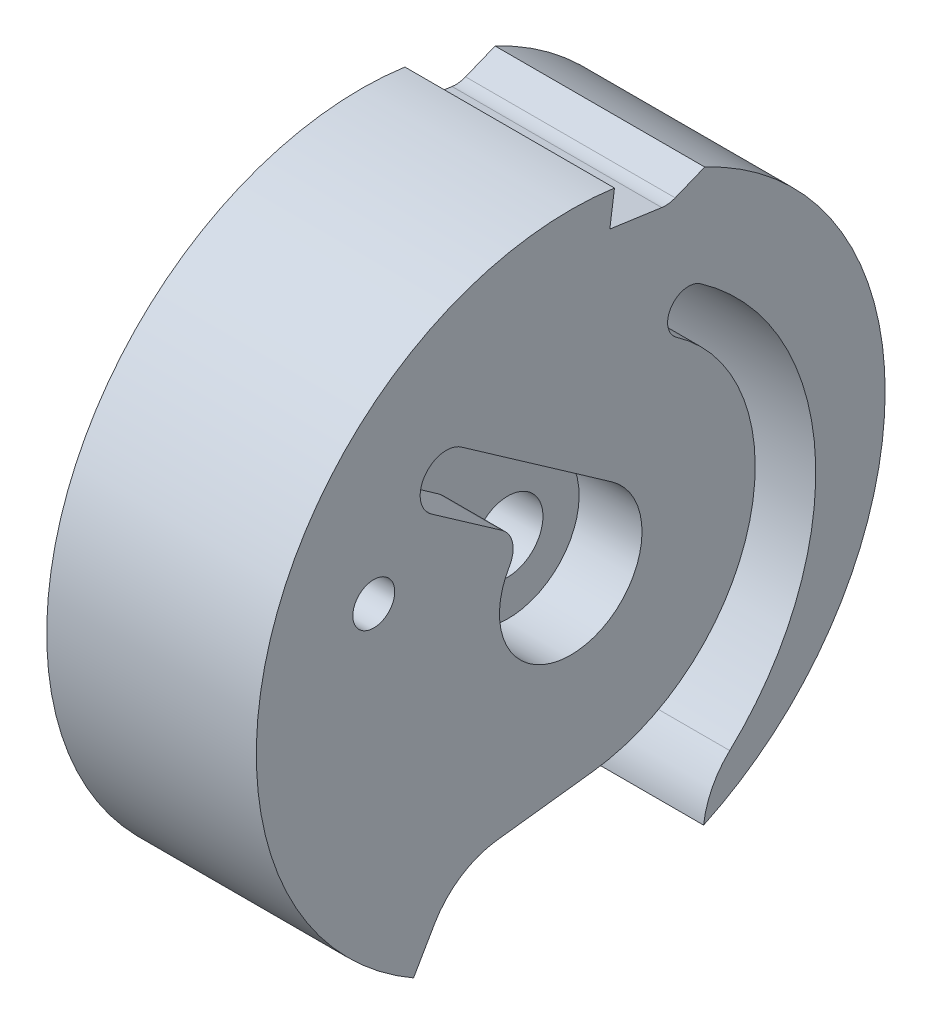
ISO-10303-21;
HEADER;
FILE_DESCRIPTION(('STEP AP214'),'2;1');
FILE_NAME('part.step','',(''),(''),'','','');
FILE_SCHEMA(('AUTOMOTIVE_DESIGN { 1 0 10303 214 1 1 1 1 }'));
ENDSEC;
DATA;
#1=APPLICATION_CONTEXT('core data for automotive mechanical design processes');
#2=APPLICATION_PROTOCOL_DEFINITION('international standard','automotive_design',2000,#1);
#3=PRODUCT_CONTEXT('',#1,'mechanical');
#4=PRODUCT('Part','Part','',(#3));
#5=PRODUCT_RELATED_PRODUCT_CATEGORY('part','',(#4));
#6=PRODUCT_DEFINITION_FORMATION('','',#4);
#7=PRODUCT_DEFINITION_CONTEXT('part definition',#1,'design');
#8=PRODUCT_DEFINITION('design','',#6,#7);
#9=PRODUCT_DEFINITION_SHAPE('','',#8);
#10=(LENGTH_UNIT() NAMED_UNIT(*) SI_UNIT(.MILLI.,.METRE.));
#11=(NAMED_UNIT(*) PLANE_ANGLE_UNIT() SI_UNIT($,.RADIAN.));
#12=(NAMED_UNIT(*) SI_UNIT($,.STERADIAN.) SOLID_ANGLE_UNIT());
#13=UNCERTAINTY_MEASURE_WITH_UNIT(LENGTH_MEASURE(1.E-05),#10,'distance_accuracy_value','');
#14=(GEOMETRIC_REPRESENTATION_CONTEXT(3) GLOBAL_UNCERTAINTY_ASSIGNED_CONTEXT((#13)) GLOBAL_UNIT_ASSIGNED_CONTEXT((#10,
#11,#12)) REPRESENTATION_CONTEXT('',''));
#15=CARTESIAN_POINT('',(0.,0.,0.));
#16=DIRECTION('',(0.,0.,1.));
#17=DIRECTION('',(1.,0.,0.));
#18=AXIS2_PLACEMENT_3D('',#15,#16,#17);
#19=CARTESIAN_POINT('',(1.27,0.,0.));
#20=DIRECTION('',(1.,0.,0.));
#21=DIRECTION('',(0.,0.,1.));
#22=AXIS2_PLACEMENT_3D('',#19,#20,#21);
#23=CYLINDRICAL_SURFACE('',#22,2.159);
#24=CARTESIAN_POINT('',(3.175,0.,0.));
#25=DIRECTION('',(-1.,0.,0.));
#26=DIRECTION('',(0.,0.,1.));
#27=AXIS2_PLACEMENT_3D('',#24,#25,#26);
#28=CIRCLE('',#27,2.159);
#29=CARTESIAN_POINT('',(3.175,1.76854926361994,-1.2383515260819));
#30=VERTEX_POINT('',#29);
#31=CARTESIAN_POINT('',(3.175,1.10172205716822,1.85674163758694));
#32=VERTEX_POINT('',#31);
#33=EDGE_CURVE('E512',#30,#32,#28,.T.);
#34=ORIENTED_EDGE('',*,*,#33,.F.);
#35=DIRECTION('',(1.,0.,0.));
#36=VECTOR('',#35,1.);
#37=CARTESIAN_POINT('',(-5.90003269482934,1.76854926361994,-1.2383515260819));
#38=LINE('',#37,#36);
#39=CARTESIAN_POINT('',(1.27,1.76854926361994,-1.2383515260819));
#40=VERTEX_POINT('',#39);
#41=EDGE_CURVE('E516',#40,#30,#38,.T.);
#42=ORIENTED_EDGE('',*,*,#41,.F.);
#43=CARTESIAN_POINT('',(1.27,0.,0.));
#44=DIRECTION('',(-1.,0.,0.));
#45=DIRECTION('',(0.,0.,1.));
#46=AXIS2_PLACEMENT_3D('',#43,#44,#45);
#47=CIRCLE('',#46,2.159);
#48=CARTESIAN_POINT('',(1.27,1.10172205716822,1.85674163758694));
#49=VERTEX_POINT('',#48);
#50=EDGE_CURVE('E528',#40,#49,#47,.T.);
#51=ORIENTED_EDGE('',*,*,#50,.T.);
#52=DIRECTION('',(1.,0.,0.));
#53=VECTOR('',#52,1.);
#54=CARTESIAN_POINT('',(1.27,1.10172205716822,1.85674163758694));
#55=LINE('',#54,#53);
#56=EDGE_CURVE('E527',#32,#49,#55,.F.);
#57=ORIENTED_EDGE('',*,*,#56,.F.);
#58=EDGE_LOOP('',(#34,#42,#51,#57));
#59=FACE_BOUND('',#58,.T.);
#60=ADVANCED_FACE('F372',(#59),#23,.F.);
#61=CARTESIAN_POINT('',(-3.175,0.,0.));
#62=DIRECTION('',(1.,0.,0.));
#63=DIRECTION('',(0.,0.,1.));
#64=AXIS2_PLACEMENT_3D('',#61,#62,#63);
#65=CYLINDRICAL_SURFACE('',#64,1.063625);
#66=CARTESIAN_POINT('',(-3.175,0.,0.));
#67=DIRECTION('',(1.,0.,0.));
#68=DIRECTION('',(0.,0.,-1.));
#69=AXIS2_PLACEMENT_3D('',#66,#67,#68);
#70=CIRCLE('',#69,1.063625);
#71=CARTESIAN_POINT('',(-3.175,0.,-1.063625));
#72=VERTEX_POINT('',#71);
#73=EDGE_CURVE('E575',#72,#72,#70,.T.);
#74=ORIENTED_EDGE('',*,*,#73,.F.);
#75=EDGE_LOOP('',(#74));
#76=FACE_BOUND('',#75,.T.);
#77=CARTESIAN_POINT('',(1.27,0.,0.));
#78=DIRECTION('',(-1.,0.,0.));
#79=DIRECTION('',(0.,0.,1.));
#80=AXIS2_PLACEMENT_3D('',#77,#78,#79);
#81=CIRCLE('',#80,1.063625);
#82=CARTESIAN_POINT('',(1.27,0.,1.063625));
#83=VERTEX_POINT('',#82);
#84=EDGE_CURVE('E531',#83,#83,#81,.T.);
#85=ORIENTED_EDGE('',*,*,#84,.F.);
#86=EDGE_LOOP('',(#85));
#87=FACE_BOUND('',#86,.T.);
#88=ADVANCED_FACE('F680',(#76,#87),#65,.F.);
#89=CARTESIAN_POINT('',(-3.175,0.,0.));
#90=DIRECTION('',(1.,0.,0.));
#91=DIRECTION('',(0.,0.,1.));
#92=AXIS2_PLACEMENT_3D('',#89,#90,#91);
#93=CYLINDRICAL_SURFACE('',#92,9.525);
#94=CARTESIAN_POINT('',(3.175,0.,0.));
#95=DIRECTION('',(1.,0.,0.));
#96=DIRECTION('',(0.,0.,-1.));
#97=AXIS2_PLACEMENT_3D('',#94,#95,#96);
#98=CIRCLE('',#97,9.525);
#99=CARTESIAN_POINT('',(3.175,-8.63258167152409,-4.02543894308017));
#100=VERTEX_POINT('',#99);
#101=CARTESIAN_POINT('',(3.175,8.61687533606395,-4.05895115057237));
#102=VERTEX_POINT('',#101);
#103=EDGE_CURVE('E582',#100,#102,#98,.T.);
#104=ORIENTED_EDGE('',*,*,#103,.F.);
#105=DIRECTION('',(1.,0.,0.));
#106=VECTOR('',#105,1.);
#107=CARTESIAN_POINT('',(-3.175,-8.63258167152409,-4.02543894308017));
#108=LINE('',#107,#106);
#109=CARTESIAN_POINT('',(-3.175,-8.63258167152409,-4.02543894308017));
#110=VERTEX_POINT('',#109);
#111=EDGE_CURVE('E624',#110,#100,#108,.T.);
#112=ORIENTED_EDGE('',*,*,#111,.F.);
#113=CARTESIAN_POINT('',(-3.175,0.,0.));
#114=DIRECTION('',(1.,0.,0.));
#115=DIRECTION('',(0.,0.,-1.));
#116=AXIS2_PLACEMENT_3D('',#113,#114,#115);
#117=CIRCLE('',#116,9.525);
#118=CARTESIAN_POINT('',(-3.175,8.61687533606395,-4.05895115057237));
#119=VERTEX_POINT('',#118);
#120=EDGE_CURVE('E601',#110,#119,#117,.T.);
#121=ORIENTED_EDGE('',*,*,#120,.T.);
#122=DIRECTION('',(-1.,0.,0.));
#123=VECTOR('',#122,1.);
#124=CARTESIAN_POINT('',(3.175,8.61687533606395,-4.05895115057237));
#125=LINE('',#124,#123);
#126=EDGE_CURVE('E559',#102,#119,#125,.T.);
#127=ORIENTED_EDGE('',*,*,#126,.F.);
#128=EDGE_LOOP('',(#104,#112,#121,#127));
#129=FACE_BOUND('',#128,.T.);
#130=ADVANCED_FACE('F685',(#129),#93,.T.);
#131=CARTESIAN_POINT('',(-3.175,-1.08440458337613,0.759308263749316));
#132=DIRECTION('',(-1.,0.,0.));
#133=DIRECTION('',(0.,0.,-1.));
#134=AXIS2_PLACEMENT_3D('',#131,#132,#133);
#135=PLANE('',#134);
#136=CARTESIAN_POINT('',(-3.175,-1.08440458337613,0.759308263749316));
#137=DIRECTION('',(-1.,0.,0.));
#138=DIRECTION('',(0.,0.,-1.));
#139=AXIS2_PLACEMENT_3D('',#136,#137,#138);
#140=CIRCLE('',#139,8.18181355932214);
#141=CARTESIAN_POINT('',(-3.175,5.61774471973393,-3.93358720049544));
#142=VERTEX_POINT('',#141);
#143=CARTESIAN_POINT('',(-3.175,-7.07179536584988,-4.8168216430459));
#144=VERTEX_POINT('',#143);
#145=EDGE_CURVE('E597',#142,#144,#140,.T.);
#146=ORIENTED_EDGE('',*,*,#145,.F.);
#147=CARTESIAN_POINT('',(-3.175,5.09758317161043,-3.56936616341251));
#148=DIRECTION('',(-1.,0.,0.));
#149=DIRECTION('',(0.,0.,1.));
#150=AXIS2_PLACEMENT_3D('',#147,#148,#149);
#151=CIRCLE('',#150,0.635);
#152=CARTESIAN_POINT('',(-3.175,4.57742162348692,-3.2051451263296));
#153=VERTEX_POINT('',#152);
#154=EDGE_CURVE('E613',#153,#142,#151,.T.);
#155=ORIENTED_EDGE('',*,*,#154,.F.);
#156=CARTESIAN_POINT('',(-3.175,0.,0.));
#157=DIRECTION('',(1.,0.,0.));
#158=DIRECTION('',(0.,0.,1.));
#159=AXIS2_PLACEMENT_3D('',#156,#157,#158);
#160=CIRCLE('',#159,5.588);
#161=CARTESIAN_POINT('',(-3.175,-5.54787996507796,-0.668409973808462));
#162=VERTEX_POINT('',#161);
#163=EDGE_CURVE('E610',#162,#153,#160,.T.);
#164=ORIENTED_EDGE('',*,*,#163,.F.);
#165=DIRECTION('',(0.,0.119615242270661,-0.992820323027551));
#166=VECTOR('',#165,1.);
#167=CARTESIAN_POINT('',(-3.175,-5.54787996507796,-0.668409973808462));
#168=LINE('',#167,#166);
#169=CARTESIAN_POINT('',(-3.175,-5.89727608775056,2.23161818975502));
#170=VERTEX_POINT('',#169);
#171=EDGE_CURVE('E607',#170,#162,#168,.T.);
#172=ORIENTED_EDGE('',*,*,#171,.F.);
#173=CARTESIAN_POINT('',(-3.175,-8.41903970824054,1.92779547438754));
#174=DIRECTION('',(1.,0.,0.));
#175=DIRECTION('',(0.,0.,-1.));
#176=AXIS2_PLACEMENT_3D('',#173,#174,#175);
#177=CIRCLE('',#176,2.54);
#178=CARTESIAN_POINT('',(-3.175,-7.14903970824053,4.12750000000001));
#179=VERTEX_POINT('',#178);
#180=EDGE_CURVE('E641',#179,#170,#177,.F.);
#181=ORIENTED_EDGE('',*,*,#180,.F.);
#182=DIRECTION('',(0.,0.866025403784438,-0.500000000000001));
#183=VECTOR('',#182,1.);
#184=CARTESIAN_POINT('',(-3.175,-6.0491874454343,3.49250000000001));
#185=LINE('',#184,#183);
#186=CARTESIAN_POINT('',(-3.175,-8.24889197104677,4.76250000000001));
#187=VERTEX_POINT('',#186);
#188=EDGE_CURVE('E604',#187,#179,#185,.T.);
#189=ORIENTED_EDGE('',*,*,#188,.F.);
#190=CARTESIAN_POINT('',(-3.175,9.43230335476346,-1.32562378664456));
#191=VERTEX_POINT('',#190);
#192=EDGE_CURVE('E600',#191,#187,#117,.T.);
#193=ORIENTED_EDGE('',*,*,#192,.F.);
#194=DIRECTION('',(0.,-0.990268068741571,0.139173100960058));
#195=VECTOR('',#194,1.);
#196=CARTESIAN_POINT('',(-3.175,9.43230335476346,-1.32562378664456));
#197=LINE('',#196,#195);
#198=CARTESIAN_POINT('',(-3.175,8.42619099692203,-1.18422391606914));
#199=VERTEX_POINT('',#198);
#200=EDGE_CURVE('E536',#191,#199,#197,.T.);
#201=ORIENTED_EDGE('',*,*,#200,.T.);
#202=DIRECTION('',(0.,-0.139173100960058,-0.990268068741571));
#203=VECTOR('',#202,1.);
#204=CARTESIAN_POINT('',(-3.175,8.42619099692203,-1.18422391606914));
#205=LINE('',#204,#203);
#206=CARTESIAN_POINT('',(-3.175,8.20525369914794,-2.75627447519638));
#207=VERTEX_POINT('',#206);
#208=EDGE_CURVE('E539',#199,#207,#205,.T.);
#209=ORIENTED_EDGE('',*,*,#208,.T.);
#210=CARTESIAN_POINT('',(-3.175,8.99127897871156,-2.86674312408343));
#211=DIRECTION('',(1.,0.,0.));
#212=DIRECTION('',(0.,0.,1.));
#213=AXIS2_PLACEMENT_3D('',#210,#211,#212);
#214=CIRCLE('',#213,0.79375);
#215=CARTESIAN_POINT('',(-3.175,8.25532679414917,-3.16408710760731));
#216=VERTEX_POINT('',#215);
#217=EDGE_CURVE('E542',#207,#216,#214,.T.);
#218=ORIENTED_EDGE('',*,*,#217,.T.);
#219=DIRECTION('',(0.,0.374606593415923,-0.927183854566783));
#220=VECTOR('',#219,1.);
#221=CARTESIAN_POINT('',(-3.175,8.25532679414917,-3.16408710760731));
#222=LINE('',#221,#220);
#223=EDGE_CURVE('E545',#216,#119,#222,.T.);
#224=ORIENTED_EDGE('',*,*,#223,.T.);
#225=ORIENTED_EDGE('',*,*,#120,.F.);
#226=CARTESIAN_POINT('',(-3.175,-8.93054862112979,-6.547901172122));
#227=DIRECTION('',(1.,0.,0.));
#228=DIRECTION('',(0.,0.,-1.));
#229=AXIS2_PLACEMENT_3D('',#226,#227,#228);
#230=CIRCLE('',#229,2.54);
#231=EDGE_CURVE('E636',#144,#110,#230,.T.);
#232=ORIENTED_EDGE('',*,*,#231,.F.);
#233=EDGE_LOOP('',(#146,#155,#164,#172,#181,#189,#193,#201,#209,#218,#224,#225,#232));
#234=FACE_BOUND('',#233,.T.);
#235=ORIENTED_EDGE('',*,*,#73,.T.);
#236=EDGE_LOOP('',(#235));
#237=FACE_BOUND('',#236,.T.);
#238=CARTESIAN_POINT('',(-3.175,2.17182791011796,5.96704814199053));
#239=DIRECTION('',(1.,0.,0.));
#240=DIRECTION('',(0.,0.,-1.));
#241=AXIS2_PLACEMENT_3D('',#238,#239,#240);
#242=CIRCLE('',#241,0.635);
#243=CARTESIAN_POINT('',(-3.175,2.17182791011796,5.33204814199053));
#244=VERTEX_POINT('',#243);
#245=EDGE_CURVE('E572',#244,#244,#242,.T.);
#246=ORIENTED_EDGE('',*,*,#245,.T.);
#247=EDGE_LOOP('',(#246));
#248=FACE_BOUND('',#247,.T.);
#249=ADVANCED_FACE('F722',(#234,#237,#248),#135,.T.);
#250=CARTESIAN_POINT('',(3.175,-1.08440458337613,0.759308263749316));
#251=DIRECTION('',(-1.,0.,0.));
#252=DIRECTION('',(0.,0.,-1.));
#253=AXIS2_PLACEMENT_3D('',#250,#251,#252);
#254=PLANE('',#253);
#255=DIRECTION('',(0.,0.57357643635104,0.819152044288996));
#256=VECTOR('',#255,1.);
#257=CARTESIAN_POINT('',(3.175,4.11035576414026,4.8738165478605));
#258=LINE('',#257,#256);
#259=CARTESIAN_POINT('',(3.175,2.15696886628151,2.08409094328732));
#260=VERTEX_POINT('',#259);
#261=CARTESIAN_POINT('',(3.175,3.65507946778662,4.22361461270611));
#262=VERTEX_POINT('',#261);
#263=EDGE_CURVE('E517',#260,#262,#258,.T.);
#264=ORIENTED_EDGE('',*,*,#263,.T.);
#265=CARTESIAN_POINT('',(3.175,4.30528140294101,3.76833831635247));
#266=DIRECTION('',(1.,0.,0.));
#267=DIRECTION('',(0.,0.,-1.));
#268=AXIS2_PLACEMENT_3D('',#265,#266,#267);
#269=CIRCLE('',#268,0.79375);
#270=CARTESIAN_POINT('',(3.175,4.76055769929465,4.41854025150686));
#271=VERTEX_POINT('',#270);
#272=EDGE_CURVE('E380',#271,#262,#269,.T.);
#273=ORIENTED_EDGE('',*,*,#272,.F.);
#274=CARTESIAN_POINT('',(3.175,4.30528140294101,3.76833831635247));
#275=DIRECTION('',(1.,0.,0.));
#276=DIRECTION('',(0.,0.,-1.));
#277=AXIS2_PLACEMENT_3D('',#274,#275,#276);
#278=CIRCLE('',#277,0.79375);
#279=CARTESIAN_POINT('',(3.175,4.9554833380954,3.31306201999883));
#280=VERTEX_POINT('',#279);
#281=EDGE_CURVE('E514',#280,#271,#278,.T.);
#282=ORIENTED_EDGE('',*,*,#281,.F.);
#283=DIRECTION('',(0.,-0.57357643635104,-0.819152044288996));
#284=VECTOR('',#283,1.);
#285=CARTESIAN_POINT('',(3.175,1.76854926361994,-1.2383515260819));
#286=LINE('',#285,#284);
#287=EDGE_CURVE('E506',#280,#30,#286,.T.);
#288=ORIENTED_EDGE('',*,*,#287,.T.);
#289=ORIENTED_EDGE('',*,*,#33,.T.);
#290=CARTESIAN_POINT('',(3.175,1.50676693112712,2.53936723964096));
#291=DIRECTION('',(1.,0.,0.));
#292=DIRECTION('',(0.,0.,-1.));
#293=AXIS2_PLACEMENT_3D('',#290,#291,#292);
#294=CIRCLE('',#293,0.79375);
#295=EDGE_CURVE('E395',#260,#32,#294,.F.);
#296=ORIENTED_EDGE('',*,*,#295,.F.);
#297=EDGE_LOOP('',(#264,#273,#282,#288,#289,#296));
#298=FACE_BOUND('',#297,.T.);
#299=ORIENTED_EDGE('',*,*,#103,.T.);
#300=DIRECTION('',(0.,0.374606593415923,-0.927183854566783));
#301=VECTOR('',#300,1.);
#302=CARTESIAN_POINT('',(3.175,8.25532679414917,-3.16408710760731));
#303=LINE('',#302,#301);
#304=CARTESIAN_POINT('',(3.175,8.25532679414917,-3.16408710760731));
#305=VERTEX_POINT('',#304);
#306=EDGE_CURVE('E556',#305,#102,#303,.T.);
#307=ORIENTED_EDGE('',*,*,#306,.F.);
#308=CARTESIAN_POINT('',(3.175,8.99127897871156,-2.86674312408343));
#309=DIRECTION('',(1.,0.,0.));
#310=DIRECTION('',(0.,0.,1.));
#311=AXIS2_PLACEMENT_3D('',#308,#309,#310);
#312=CIRCLE('',#311,0.79375);
#313=CARTESIAN_POINT('',(3.175,8.20525369914794,-2.75627447519638));
#314=VERTEX_POINT('',#313);
#315=EDGE_CURVE('E553',#314,#305,#312,.T.);
#316=ORIENTED_EDGE('',*,*,#315,.F.);
#317=DIRECTION('',(0.,-0.139173100960058,-0.990268068741571));
#318=VECTOR('',#317,1.);
#319=CARTESIAN_POINT('',(3.175,8.42619099692203,-1.18422391606914));
#320=LINE('',#319,#318);
#321=CARTESIAN_POINT('',(3.175,8.42619099692203,-1.18422391606914));
#322=VERTEX_POINT('',#321);
#323=EDGE_CURVE('E550',#322,#314,#320,.T.);
#324=ORIENTED_EDGE('',*,*,#323,.F.);
#325=DIRECTION('',(0.,-0.990268068741571,0.139173100960058));
#326=VECTOR('',#325,1.);
#327=CARTESIAN_POINT('',(3.175,9.43230335476346,-1.32562378664456));
#328=LINE('',#327,#326);
#329=CARTESIAN_POINT('',(3.175,9.43230335476346,-1.32562378664456));
#330=VERTEX_POINT('',#329);
#331=EDGE_CURVE('E547',#330,#322,#328,.T.);
#332=ORIENTED_EDGE('',*,*,#331,.F.);
#333=CARTESIAN_POINT('',(3.175,-8.24889197104677,4.76250000000001));
#334=VERTEX_POINT('',#333);
#335=EDGE_CURVE('E581',#330,#334,#98,.T.);
#336=ORIENTED_EDGE('',*,*,#335,.T.);
#337=DIRECTION('',(0.,0.866025403784438,-0.500000000000001));
#338=VECTOR('',#337,1.);
#339=CARTESIAN_POINT('',(3.175,-6.0491874454343,3.49250000000001));
#340=LINE('',#339,#338);
#341=CARTESIAN_POINT('',(3.175,-7.14903970824053,4.12750000000001));
#342=VERTEX_POINT('',#341);
#343=EDGE_CURVE('E585',#334,#342,#340,.T.);
#344=ORIENTED_EDGE('',*,*,#343,.T.);
#345=CARTESIAN_POINT('',(3.175,-8.41903970824054,1.92779547438754));
#346=DIRECTION('',(1.,0.,0.));
#347=DIRECTION('',(0.,0.,-1.));
#348=AXIS2_PLACEMENT_3D('',#345,#346,#347);
#349=CIRCLE('',#348,2.54);
#350=CARTESIAN_POINT('',(3.175,-5.89727608775056,2.23161818975502));
#351=VERTEX_POINT('',#350);
#352=EDGE_CURVE('E638',#351,#342,#349,.T.);
#353=ORIENTED_EDGE('',*,*,#352,.F.);
#354=DIRECTION('',(0.,0.119615242270661,-0.992820323027551));
#355=VECTOR('',#354,1.);
#356=CARTESIAN_POINT('',(3.175,-5.54787996507796,-0.668409973808462));
#357=LINE('',#356,#355);
#358=CARTESIAN_POINT('',(3.175,-5.54787996507796,-0.668409973808462));
#359=VERTEX_POINT('',#358);
#360=EDGE_CURVE('E588',#351,#359,#357,.T.);
#361=ORIENTED_EDGE('',*,*,#360,.T.);
#362=CARTESIAN_POINT('',(3.175,0.,0.));
#363=DIRECTION('',(1.,0.,0.));
#364=DIRECTION('',(0.,0.,-1.));
#365=AXIS2_PLACEMENT_3D('',#362,#363,#364);
#366=CIRCLE('',#365,5.588);
#367=CARTESIAN_POINT('',(3.175,4.57742162348692,-3.2051451263296));
#368=VERTEX_POINT('',#367);
#369=EDGE_CURVE('E591',#359,#368,#366,.T.);
#370=ORIENTED_EDGE('',*,*,#369,.T.);
#371=CARTESIAN_POINT('',(3.175,5.09758317161043,-3.56936616341251));
#372=DIRECTION('',(-1.,0.,0.));
#373=DIRECTION('',(0.,0.,1.));
#374=AXIS2_PLACEMENT_3D('',#371,#372,#373);
#375=CIRCLE('',#374,0.635);
#376=CARTESIAN_POINT('',(3.175,5.61774471973393,-3.93358720049544));
#377=VERTEX_POINT('',#376);
#378=EDGE_CURVE('E594',#368,#377,#375,.T.);
#379=ORIENTED_EDGE('',*,*,#378,.T.);
#380=CARTESIAN_POINT('',(3.175,-1.08440458337613,0.759308263749316));
#381=DIRECTION('',(-1.,0.,0.));
#382=DIRECTION('',(0.,0.,-1.));
#383=AXIS2_PLACEMENT_3D('',#380,#381,#382);
#384=CIRCLE('',#383,8.18181355932214);
#385=CARTESIAN_POINT('',(3.175,-7.07179536584988,-4.8168216430459));
#386=VERTEX_POINT('',#385);
#387=EDGE_CURVE('E578',#377,#386,#384,.T.);
#388=ORIENTED_EDGE('',*,*,#387,.T.);
#389=CARTESIAN_POINT('',(3.175,-8.93054862112979,-6.547901172122));
#390=DIRECTION('',(1.,0.,0.));
#391=DIRECTION('',(0.,0.,-1.));
#392=AXIS2_PLACEMENT_3D('',#389,#390,#391);
#393=CIRCLE('',#392,2.54);
#394=EDGE_CURVE('E631',#100,#386,#393,.F.);
#395=ORIENTED_EDGE('',*,*,#394,.F.);
#396=EDGE_LOOP('',(#299,#307,#316,#324,#332,#336,#344,#353,#361,#370,#379,#388,#395));
#397=FACE_BOUND('',#396,.T.);
#398=CARTESIAN_POINT('',(3.175,2.17182791011796,5.96704814199053));
#399=DIRECTION('',(1.,0.,0.));
#400=DIRECTION('',(0.,0.,-1.));
#401=AXIS2_PLACEMENT_3D('',#398,#399,#400);
#402=CIRCLE('',#401,0.635);
#403=CARTESIAN_POINT('',(3.175,2.17182791011796,5.33204814199053));
#404=VERTEX_POINT('',#403);
#405=EDGE_CURVE('E562',#404,#404,#402,.T.);
#406=ORIENTED_EDGE('',*,*,#405,.F.);
#407=EDGE_LOOP('',(#406));
#408=FACE_BOUND('',#407,.T.);
#409=ADVANCED_FACE('F509',(#298,#397,#408),#254,.F.);
#410=CARTESIAN_POINT('',(-3.175,-1.08440458337613,0.759308263749316));
#411=DIRECTION('',(1.,0.,0.));
#412=DIRECTION('',(0.,0.,1.));
#413=AXIS2_PLACEMENT_3D('',#410,#411,#412);
#414=CYLINDRICAL_SURFACE('',#413,8.18181355932214);
#415=ORIENTED_EDGE('',*,*,#387,.F.);
#416=DIRECTION('',(1.,0.,0.));
#417=VECTOR('',#416,1.);
#418=CARTESIAN_POINT('',(-3.175,5.61774471973393,-3.93358720049544));
#419=LINE('',#418,#417);
#420=EDGE_CURVE('E616',#142,#377,#419,.T.);
#421=ORIENTED_EDGE('',*,*,#420,.F.);
#422=ORIENTED_EDGE('',*,*,#145,.T.);
#423=DIRECTION('',(1.,0.,0.));
#424=VECTOR('',#423,1.);
#425=CARTESIAN_POINT('',(-3.175,-7.07179536584988,-4.8168216430459));
#426=LINE('',#425,#424);
#427=EDGE_CURVE('E634',#386,#144,#426,.F.);
#428=ORIENTED_EDGE('',*,*,#427,.F.);
#429=EDGE_LOOP('',(#415,#421,#422,#428));
#430=FACE_BOUND('',#429,.T.);
#431=ADVANCED_FACE('F374',(#430),#414,.F.);
#432=ORIENTED_EDGE('',*,*,#192,.T.);
#433=DIRECTION('',(1.,0.,0.));
#434=VECTOR('',#433,1.);
#435=CARTESIAN_POINT('',(-3.175,-8.24889197104677,4.76250000000001));
#436=LINE('',#435,#434);
#437=EDGE_CURVE('E622',#187,#334,#436,.T.);
#438=ORIENTED_EDGE('',*,*,#437,.T.);
#439=ORIENTED_EDGE('',*,*,#335,.F.);
#440=DIRECTION('',(-1.,0.,0.));
#441=VECTOR('',#440,1.);
#442=CARTESIAN_POINT('',(3.175,9.43230335476346,-1.32562378664456));
#443=LINE('',#442,#441);
#444=EDGE_CURVE('E558',#330,#191,#443,.T.);
#445=ORIENTED_EDGE('',*,*,#444,.T.);
#446=EDGE_LOOP('',(#432,#438,#439,#445));
#447=FACE_BOUND('',#446,.T.);
#448=ADVANCED_FACE('F739',(#447),#93,.T.);
#449=CARTESIAN_POINT('',(-3.175,-6.0491874454343,3.49250000000001));
#450=DIRECTION('',(0.,0.500000000000001,0.866025403784438));
#451=DIRECTION('',(0.,-0.866025403784438,0.500000000000001));
#452=AXIS2_PLACEMENT_3D('',#449,#450,#451);
#453=PLANE('',#452);
#454=ORIENTED_EDGE('',*,*,#343,.F.);
#455=ORIENTED_EDGE('',*,*,#437,.F.);
#456=ORIENTED_EDGE('',*,*,#188,.T.);
#457=DIRECTION('',(1.,0.,0.));
#458=VECTOR('',#457,1.);
#459=CARTESIAN_POINT('',(-3.175,-7.14903970824053,4.12750000000001));
#460=LINE('',#459,#458);
#461=EDGE_CURVE('E629',#342,#179,#460,.F.);
#462=ORIENTED_EDGE('',*,*,#461,.F.);
#463=EDGE_LOOP('',(#454,#455,#456,#462));
#464=FACE_BOUND('',#463,.T.);
#465=ADVANCED_FACE('F736',(#464),#453,.F.);
#466=CARTESIAN_POINT('',(-3.175,-5.54787996507796,-0.668409973808462));
#467=DIRECTION('',(0.,0.992820323027551,0.119615242270661));
#468=DIRECTION('',(0.,-0.119615242270661,0.992820323027551));
#469=AXIS2_PLACEMENT_3D('',#466,#467,#468);
#470=PLANE('',#469);
#471=ORIENTED_EDGE('',*,*,#171,.T.);
#472=DIRECTION('',(1.,0.,0.));
#473=VECTOR('',#472,1.);
#474=CARTESIAN_POINT('',(-3.175,-5.54787996507796,-0.668409973808462));
#475=LINE('',#474,#473);
#476=EDGE_CURVE('E620',#162,#359,#475,.T.);
#477=ORIENTED_EDGE('',*,*,#476,.T.);
#478=ORIENTED_EDGE('',*,*,#360,.F.);
#479=DIRECTION('',(1.,0.,0.));
#480=VECTOR('',#479,1.);
#481=CARTESIAN_POINT('',(3.175,-5.89727608775056,2.23161818975502));
#482=LINE('',#481,#480);
#483=EDGE_CURVE('E627',#170,#351,#482,.T.);
#484=ORIENTED_EDGE('',*,*,#483,.F.);
#485=EDGE_LOOP('',(#471,#477,#478,#484));
#486=FACE_BOUND('',#485,.T.);
#487=ADVANCED_FACE('F732',(#486),#470,.F.);
#488=CARTESIAN_POINT('',(-3.175,0.,0.));
#489=DIRECTION('',(1.,0.,0.));
#490=DIRECTION('',(0.,0.,1.));
#491=AXIS2_PLACEMENT_3D('',#488,#489,#490);
#492=CYLINDRICAL_SURFACE('',#491,5.588);
#493=ORIENTED_EDGE('',*,*,#369,.F.);
#494=ORIENTED_EDGE('',*,*,#476,.F.);
#495=ORIENTED_EDGE('',*,*,#163,.T.);
#496=DIRECTION('',(1.,0.,0.));
#497=VECTOR('',#496,1.);
#498=CARTESIAN_POINT('',(-3.175,4.57742162348692,-3.2051451263296));
#499=LINE('',#498,#497);
#500=EDGE_CURVE('E618',#153,#368,#499,.T.);
#501=ORIENTED_EDGE('',*,*,#500,.T.);
#502=EDGE_LOOP('',(#493,#494,#495,#501));
#503=FACE_BOUND('',#502,.T.);
#504=ADVANCED_FACE('F728',(#503),#492,.T.);
#505=CARTESIAN_POINT('',(-3.175,5.09758317161043,-3.56936616341251));
#506=DIRECTION('',(1.,0.,0.));
#507=DIRECTION('',(0.,0.,1.));
#508=AXIS2_PLACEMENT_3D('',#505,#506,#507);
#509=CYLINDRICAL_SURFACE('',#508,0.635);
#510=ORIENTED_EDGE('',*,*,#378,.F.);
#511=ORIENTED_EDGE('',*,*,#500,.F.);
#512=ORIENTED_EDGE('',*,*,#154,.T.);
#513=ORIENTED_EDGE('',*,*,#420,.T.);
#514=EDGE_LOOP('',(#510,#511,#512,#513));
#515=FACE_BOUND('',#514,.T.);
#516=ADVANCED_FACE('F717',(#515),#509,.F.);
#517=CARTESIAN_POINT('',(-3.175,2.17182791011796,5.96704814199053));
#518=DIRECTION('',(1.,0.,0.));
#519=DIRECTION('',(0.,0.,1.));
#520=AXIS2_PLACEMENT_3D('',#517,#518,#519);
#521=CYLINDRICAL_SURFACE('',#520,0.635);
#522=ORIENTED_EDGE('',*,*,#245,.F.);
#523=EDGE_LOOP('',(#522));
#524=FACE_BOUND('',#523,.T.);
#525=ORIENTED_EDGE('',*,*,#405,.T.);
#526=EDGE_LOOP('',(#525));
#527=FACE_BOUND('',#526,.T.);
#528=ADVANCED_FACE('F704',(#524,#527),#521,.F.);
#529=CARTESIAN_POINT('',(3.175,8.25532679414917,-3.16408710760731));
#530=DIRECTION('',(0.,-0.927183854566783,-0.374606593415923));
#531=DIRECTION('',(0.,0.374606593415923,-0.927183854566783));
#532=AXIS2_PLACEMENT_3D('',#529,#530,#531);
#533=PLANE('',#532);
#534=ORIENTED_EDGE('',*,*,#223,.F.);
#535=DIRECTION('',(-1.,0.,0.));
#536=VECTOR('',#535,1.);
#537=CARTESIAN_POINT('',(3.175,8.25532679414917,-3.16408710760731));
#538=LINE('',#537,#536);
#539=EDGE_CURVE('E563',#305,#216,#538,.T.);
#540=ORIENTED_EDGE('',*,*,#539,.F.);
#541=ORIENTED_EDGE('',*,*,#306,.T.);
#542=ORIENTED_EDGE('',*,*,#126,.T.);
#543=EDGE_LOOP('',(#534,#540,#541,#542));
#544=FACE_BOUND('',#543,.T.);
#545=ADVANCED_FACE('F700',(#544),#533,.F.);
#546=CARTESIAN_POINT('',(3.175,8.99127897871156,-2.86674312408343));
#547=DIRECTION('',(-1.,0.,0.));
#548=DIRECTION('',(0.,0.,-1.));
#549=AXIS2_PLACEMENT_3D('',#546,#547,#548);
#550=CYLINDRICAL_SURFACE('',#549,0.79375);
#551=ORIENTED_EDGE('',*,*,#217,.F.);
#552=DIRECTION('',(-1.,0.,0.));
#553=VECTOR('',#552,1.);
#554=CARTESIAN_POINT('',(3.175,8.20525369914794,-2.75627447519638));
#555=LINE('',#554,#553);
#556=EDGE_CURVE('E565',#314,#207,#555,.T.);
#557=ORIENTED_EDGE('',*,*,#556,.F.);
#558=ORIENTED_EDGE('',*,*,#315,.T.);
#559=ORIENTED_EDGE('',*,*,#539,.T.);
#560=EDGE_LOOP('',(#551,#557,#558,#559));
#561=FACE_BOUND('',#560,.T.);
#562=ADVANCED_FACE('F703',(#561),#550,.F.);
#563=CARTESIAN_POINT('',(3.175,8.42619099692203,-1.18422391606914));
#564=DIRECTION('',(0.,-0.990268068741571,0.139173100960058));
#565=DIRECTION('',(0.,-0.139173100960058,-0.990268068741571));
#566=AXIS2_PLACEMENT_3D('',#563,#564,#565);
#567=PLANE('',#566);
#568=ORIENTED_EDGE('',*,*,#208,.F.);
#569=DIRECTION('',(-1.,0.,0.));
#570=VECTOR('',#569,1.);
#571=CARTESIAN_POINT('',(3.175,8.42619099692203,-1.18422391606914));
#572=LINE('',#571,#570);
#573=EDGE_CURVE('E567',#322,#199,#572,.T.);
#574=ORIENTED_EDGE('',*,*,#573,.F.);
#575=ORIENTED_EDGE('',*,*,#323,.T.);
#576=ORIENTED_EDGE('',*,*,#556,.T.);
#577=EDGE_LOOP('',(#568,#574,#575,#576));
#578=FACE_BOUND('',#577,.T.);
#579=ADVANCED_FACE('F708',(#578),#567,.F.);
#580=CARTESIAN_POINT('',(3.175,9.43230335476346,-1.32562378664456));
#581=DIRECTION('',(0.,0.139173100960058,0.990268068741571));
#582=DIRECTION('',(0.,-0.990268068741571,0.139173100960058));
#583=AXIS2_PLACEMENT_3D('',#580,#581,#582);
#584=PLANE('',#583);
#585=ORIENTED_EDGE('',*,*,#200,.F.);
#586=ORIENTED_EDGE('',*,*,#444,.F.);
#587=ORIENTED_EDGE('',*,*,#331,.T.);
#588=ORIENTED_EDGE('',*,*,#573,.T.);
#589=EDGE_LOOP('',(#585,#586,#587,#588));
#590=FACE_BOUND('',#589,.T.);
#591=ADVANCED_FACE('F698',(#590),#584,.F.);
#592=CARTESIAN_POINT('',(-3.175,-8.41903970824054,1.92779547438754));
#593=DIRECTION('',(-1.,0.,0.));
#594=DIRECTION('',(0.,0.,-1.));
#595=AXIS2_PLACEMENT_3D('',#592,#593,#594);
#596=CYLINDRICAL_SURFACE('',#595,2.54);
#597=ORIENTED_EDGE('',*,*,#180,.T.);
#598=ORIENTED_EDGE('',*,*,#483,.T.);
#599=ORIENTED_EDGE('',*,*,#352,.T.);
#600=ORIENTED_EDGE('',*,*,#461,.T.);
#601=EDGE_LOOP('',(#597,#598,#599,#600));
#602=FACE_BOUND('',#601,.T.);
#603=ADVANCED_FACE('F694',(#602),#596,.F.);
#604=CARTESIAN_POINT('',(-3.175,-8.93054862112979,-6.547901172122));
#605=DIRECTION('',(1.,0.,0.));
#606=DIRECTION('',(0.,0.,1.));
#607=AXIS2_PLACEMENT_3D('',#604,#605,#606);
#608=CYLINDRICAL_SURFACE('',#607,2.54);
#609=ORIENTED_EDGE('',*,*,#231,.T.);
#610=ORIENTED_EDGE('',*,*,#111,.T.);
#611=ORIENTED_EDGE('',*,*,#394,.T.);
#612=ORIENTED_EDGE('',*,*,#427,.T.);
#613=EDGE_LOOP('',(#609,#610,#611,#612));
#614=FACE_BOUND('',#613,.T.);
#615=ADVANCED_FACE('F691',(#614),#608,.T.);
#616=CARTESIAN_POINT('',(1.27,0.,0.));
#617=DIRECTION('',(1.,0.,0.));
#618=DIRECTION('',(0.,0.,1.));
#619=AXIS2_PLACEMENT_3D('',#616,#617,#618);
#620=PLANE('',#619);
#621=ORIENTED_EDGE('',*,*,#84,.T.);
#622=EDGE_LOOP('',(#621));
#623=FACE_BOUND('',#622,.T.);
#624=CARTESIAN_POINT('',(1.27,4.30528140294101,3.76833831635247));
#625=DIRECTION('',(-1.,0.,0.));
#626=DIRECTION('',(0.,0.,1.));
#627=AXIS2_PLACEMENT_3D('',#624,#625,#626);
#628=CIRCLE('',#627,0.79375);
#629=CARTESIAN_POINT('',(1.27,3.65507946778662,4.22361461270611));
#630=VERTEX_POINT('',#629);
#631=CARTESIAN_POINT('',(1.27,4.76055769929465,4.41854025150686));
#632=VERTEX_POINT('',#631);
#633=EDGE_CURVE('E648',#630,#632,#628,.T.);
#634=ORIENTED_EDGE('',*,*,#633,.F.);
#635=DIRECTION('',(0.,-0.57357643635104,-0.819152044288996));
#636=VECTOR('',#635,1.);
#637=CARTESIAN_POINT('',(1.27,4.11035576414026,4.8738165478605));
#638=LINE('',#637,#636);
#639=CARTESIAN_POINT('',(1.27,2.15696886628151,2.08409094328732));
#640=VERTEX_POINT('',#639);
#641=EDGE_CURVE('E529',#630,#640,#638,.T.);
#642=ORIENTED_EDGE('',*,*,#641,.T.);
#643=CARTESIAN_POINT('',(1.27,1.50676693112712,2.53936723964096));
#644=DIRECTION('',(-1.,0.,0.));
#645=DIRECTION('',(0.,0.,1.));
#646=AXIS2_PLACEMENT_3D('',#643,#644,#645);
#647=CIRCLE('',#646,0.79375);
#648=EDGE_CURVE('E11',#49,#640,#647,.F.);
#649=ORIENTED_EDGE('',*,*,#648,.F.);
#650=ORIENTED_EDGE('',*,*,#50,.F.);
#651=DIRECTION('',(0.,0.57357643635104,0.819152044288996));
#652=VECTOR('',#651,1.);
#653=CARTESIAN_POINT('',(1.27,1.76854926361994,-1.2383515260819));
#654=LINE('',#653,#652);
#655=CARTESIAN_POINT('',(1.27,4.9554833380954,3.31306201999883));
#656=VERTEX_POINT('',#655);
#657=EDGE_CURVE('E522',#40,#656,#654,.T.);
#658=ORIENTED_EDGE('',*,*,#657,.T.);
#659=CARTESIAN_POINT('',(1.27,4.30528140294101,3.76833831635247));
#660=DIRECTION('',(-1.,0.,0.));
#661=DIRECTION('',(0.,0.,1.));
#662=AXIS2_PLACEMENT_3D('',#659,#660,#661);
#663=CIRCLE('',#662,0.79375);
#664=EDGE_CURVE('E650',#632,#656,#663,.T.);
#665=ORIENTED_EDGE('',*,*,#664,.F.);
#666=EDGE_LOOP('',(#634,#642,#649,#650,#658,#665));
#667=FACE_BOUND('',#666,.T.);
#668=ADVANCED_FACE('F669',(#623,#667),#620,.T.);
#669=CARTESIAN_POINT('',(-5.90003269482934,1.76854926361994,-1.2383515260819));
#670=DIRECTION('',(0.,0.819152044288996,-0.57357643635104));
#671=DIRECTION('',(0.,0.57357643635104,0.819152044288996));
#672=AXIS2_PLACEMENT_3D('',#669,#670,#671);
#673=PLANE('',#672);
#674=ORIENTED_EDGE('',*,*,#657,.F.);
#675=ORIENTED_EDGE('',*,*,#41,.T.);
#676=ORIENTED_EDGE('',*,*,#287,.F.);
#677=DIRECTION('',(1.,0.,0.));
#678=VECTOR('',#677,1.);
#679=CARTESIAN_POINT('',(3.175,4.9554833380954,3.31306201999883));
#680=LINE('',#679,#678);
#681=EDGE_CURVE('E644',#656,#280,#680,.T.);
#682=ORIENTED_EDGE('',*,*,#681,.F.);
#683=EDGE_LOOP('',(#674,#675,#676,#682));
#684=FACE_BOUND('',#683,.T.);
#685=ADVANCED_FACE('F520',(#684),#673,.F.);
#686=CARTESIAN_POINT('',(-5.90003269482934,4.11035576414026,4.8738165478605));
#687=DIRECTION('',(0.,-0.819152044288996,0.57357643635104));
#688=DIRECTION('',(0.,-0.57357643635104,-0.819152044288996));
#689=AXIS2_PLACEMENT_3D('',#686,#687,#688);
#690=PLANE('',#689);
#691=ORIENTED_EDGE('',*,*,#263,.F.);
#692=DIRECTION('',(1.,0.,0.));
#693=VECTOR('',#692,1.);
#694=CARTESIAN_POINT('',(-5.90003269482934,2.15696886628151,2.08409094328732));
#695=LINE('',#694,#693);
#696=EDGE_CURVE('E653',#640,#260,#695,.T.);
#697=ORIENTED_EDGE('',*,*,#696,.F.);
#698=ORIENTED_EDGE('',*,*,#641,.F.);
#699=DIRECTION('',(1.,0.,0.));
#700=VECTOR('',#699,1.);
#701=CARTESIAN_POINT('',(1.27,3.65507946778662,4.22361461270611));
#702=LINE('',#701,#700);
#703=EDGE_CURVE('E655',#262,#630,#702,.F.);
#704=ORIENTED_EDGE('',*,*,#703,.F.);
#705=EDGE_LOOP('',(#691,#697,#698,#704));
#706=FACE_BOUND('',#705,.T.);
#707=ADVANCED_FACE('F794',(#706),#690,.F.);
#708=CARTESIAN_POINT('',(-5.90003269482934,4.30528140294101,3.76833831635247));
#709=DIRECTION('',(-1.,0.,0.));
#710=DIRECTION('',(0.,0.,-1.));
#711=AXIS2_PLACEMENT_3D('',#708,#709,#710);
#712=CYLINDRICAL_SURFACE('',#711,0.79375);
#713=DIRECTION('',(1.,0.,0.));
#714=VECTOR('',#713,1.);
#715=CARTESIAN_POINT('',(3.175,4.76055769929465,4.41854025150686));
#716=LINE('',#715,#714);
#717=EDGE_CURVE('E387',#632,#271,#716,.T.);
#718=ORIENTED_EDGE('',*,*,#717,.T.);
#719=ORIENTED_EDGE('',*,*,#272,.T.);
#720=ORIENTED_EDGE('',*,*,#703,.T.);
#721=ORIENTED_EDGE('',*,*,#633,.T.);
#722=EDGE_LOOP('',(#718,#719,#720,#721));
#723=FACE_BOUND('',#722,.T.);
#724=ADVANCED_FACE('F659',(#723),#712,.F.);
#725=CARTESIAN_POINT('',(-5.90003269482934,4.30528140294101,3.76833831635247));
#726=DIRECTION('',(-1.,0.,0.));
#727=DIRECTION('',(0.,0.,-1.));
#728=AXIS2_PLACEMENT_3D('',#725,#726,#727);
#729=CYLINDRICAL_SURFACE('',#728,0.79375);
#730=ORIENTED_EDGE('',*,*,#664,.T.);
#731=ORIENTED_EDGE('',*,*,#681,.T.);
#732=ORIENTED_EDGE('',*,*,#281,.T.);
#733=ORIENTED_EDGE('',*,*,#717,.F.);
#734=EDGE_LOOP('',(#730,#731,#732,#733));
#735=FACE_BOUND('',#734,.T.);
#736=ADVANCED_FACE('F672',(#735),#729,.F.);
#737=CARTESIAN_POINT('',(1.27,1.50676693112712,2.53936723964096));
#738=DIRECTION('',(1.,0.,0.));
#739=DIRECTION('',(0.,0.,1.));
#740=AXIS2_PLACEMENT_3D('',#737,#738,#739);
#741=CYLINDRICAL_SURFACE('',#740,0.79375);
#742=ORIENTED_EDGE('',*,*,#648,.T.);
#743=ORIENTED_EDGE('',*,*,#696,.T.);
#744=ORIENTED_EDGE('',*,*,#295,.T.);
#745=ORIENTED_EDGE('',*,*,#56,.T.);
#746=EDGE_LOOP('',(#742,#743,#744,#745));
#747=FACE_BOUND('',#746,.T.);
#748=ADVANCED_FACE('F670',(#747),#741,.T.);
#749=CLOSED_SHELL('',(#60,#88,#130,#249,#409,#431,#448,#465,#487,#504,#516,#528,#545,#562,#579,
#591,#603,#615,#668,#685,#707,#724,#736,#748));
#750=MANIFOLD_SOLID_BREP('B2',#749);
#751=ADVANCED_BREP_SHAPE_REPRESENTATION('',(#18,#750),#14);
#752=SHAPE_DEFINITION_REPRESENTATION(#9,#751);
ENDSEC;
END-ISO-10303-21;
